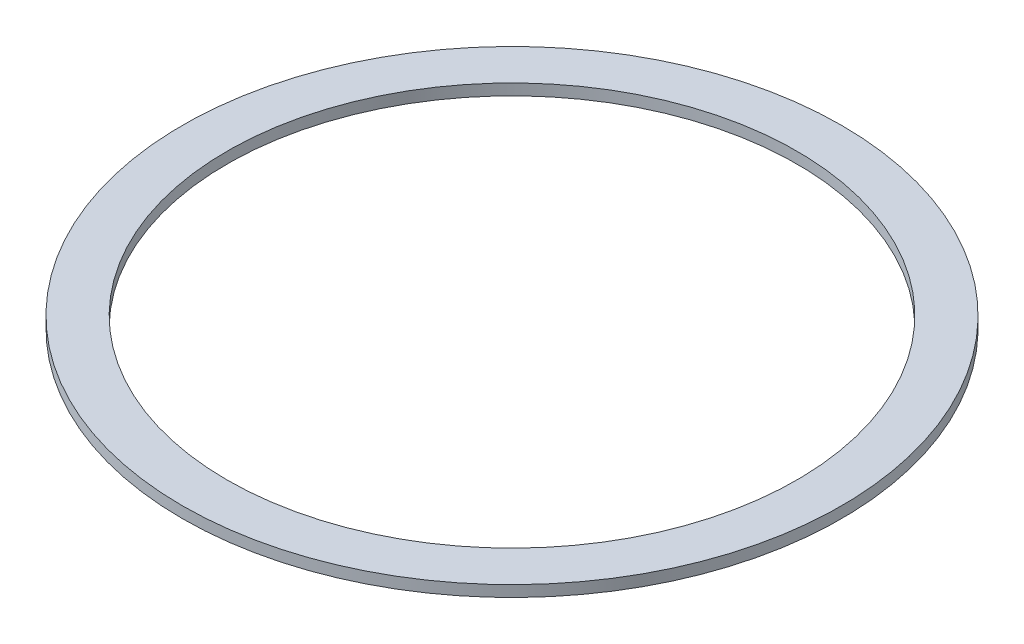
ISO-10303-21;
HEADER;
FILE_DESCRIPTION(('STEP AP214'),'2;1');
FILE_NAME('part.step','',(''),(''),'','','');
FILE_SCHEMA(('AUTOMOTIVE_DESIGN { 1 0 10303 214 1 1 1 1 }'));
ENDSEC;
DATA;
#1=APPLICATION_CONTEXT('core data for automotive mechanical design processes');
#2=APPLICATION_PROTOCOL_DEFINITION('international standard','automotive_design',2000,#1);
#3=PRODUCT_CONTEXT('',#1,'mechanical');
#4=PRODUCT('Part','Part','',(#3));
#5=PRODUCT_RELATED_PRODUCT_CATEGORY('part','',(#4));
#6=PRODUCT_DEFINITION_FORMATION('','',#4);
#7=PRODUCT_DEFINITION_CONTEXT('part definition',#1,'design');
#8=PRODUCT_DEFINITION('design','',#6,#7);
#9=PRODUCT_DEFINITION_SHAPE('','',#8);
#10=(LENGTH_UNIT() NAMED_UNIT(*) SI_UNIT(.MILLI.,.METRE.));
#11=(NAMED_UNIT(*) PLANE_ANGLE_UNIT() SI_UNIT($,.RADIAN.));
#12=(NAMED_UNIT(*) SI_UNIT($,.STERADIAN.) SOLID_ANGLE_UNIT());
#13=UNCERTAINTY_MEASURE_WITH_UNIT(LENGTH_MEASURE(1.E-05),#10,'distance_accuracy_value','');
#14=(GEOMETRIC_REPRESENTATION_CONTEXT(3) GLOBAL_UNCERTAINTY_ASSIGNED_CONTEXT((#13)) GLOBAL_UNIT_ASSIGNED_CONTEXT((#10,
#11,#12)) REPRESENTATION_CONTEXT('',''));
#15=CARTESIAN_POINT('',(0.,0.,0.));
#16=DIRECTION('',(0.,0.,1.));
#17=DIRECTION('',(1.,0.,0.));
#18=AXIS2_PLACEMENT_3D('',#15,#16,#17);
#19=CARTESIAN_POINT('',(0.,5.,0.));
#20=DIRECTION('',(0.,1.,0.));
#21=DIRECTION('',(0.,0.,1.));
#22=AXIS2_PLACEMENT_3D('',#19,#20,#21);
#23=PLANE('',#22);
#24=CARTESIAN_POINT('',(0.,5.,0.));
#25=DIRECTION('',(0.,1.,0.));
#26=DIRECTION('',(0.,0.,1.));
#27=AXIS2_PLACEMENT_3D('',#24,#25,#26);
#28=CIRCLE('',#27,295.);
#29=CARTESIAN_POINT('',(0.,5.,295.));
#30=VERTEX_POINT('',#29);
#31=EDGE_CURVE('E10',#30,#30,#28,.T.);
#32=ORIENTED_EDGE('',*,*,#31,.T.);
#33=EDGE_LOOP('',(#32));
#34=FACE_BOUND('',#33,.T.);
#35=CARTESIAN_POINT('',(0.,5.,0.));
#36=DIRECTION('',(0.,1.,0.));
#37=DIRECTION('',(0.,0.,1.));
#38=AXIS2_PLACEMENT_3D('',#35,#36,#37);
#39=CIRCLE('',#38,255.);
#40=CARTESIAN_POINT('',(0.,5.,255.));
#41=VERTEX_POINT('',#40);
#42=EDGE_CURVE('E50',#41,#41,#39,.T.);
#43=ORIENTED_EDGE('',*,*,#42,.F.);
#44=EDGE_LOOP('',(#43));
#45=FACE_BOUND('',#44,.T.);
#46=ADVANCED_FACE('F37',(#34,#45),#23,.T.);
#47=CARTESIAN_POINT('',(0.,-5.,0.));
#48=DIRECTION('',(0.,1.,0.));
#49=DIRECTION('',(0.,0.,1.));
#50=AXIS2_PLACEMENT_3D('',#47,#48,#49);
#51=PLANE('',#50);
#52=CARTESIAN_POINT('',(0.,-5.,0.));
#53=DIRECTION('',(0.,1.,0.));
#54=DIRECTION('',(0.,0.,1.));
#55=AXIS2_PLACEMENT_3D('',#52,#53,#54);
#56=CIRCLE('',#55,295.);
#57=CARTESIAN_POINT('',(0.,-5.,295.));
#58=VERTEX_POINT('',#57);
#59=EDGE_CURVE('E41',#58,#58,#56,.T.);
#60=ORIENTED_EDGE('',*,*,#59,.F.);
#61=EDGE_LOOP('',(#60));
#62=FACE_BOUND('',#61,.T.);
#63=CARTESIAN_POINT('',(0.,-5.,0.));
#64=DIRECTION('',(0.,1.,0.));
#65=DIRECTION('',(0.,0.,1.));
#66=AXIS2_PLACEMENT_3D('',#63,#64,#65);
#67=CIRCLE('',#66,255.);
#68=CARTESIAN_POINT('',(0.,-5.,255.));
#69=VERTEX_POINT('',#68);
#70=EDGE_CURVE('E52',#69,#69,#67,.T.);
#71=ORIENTED_EDGE('',*,*,#70,.T.);
#72=EDGE_LOOP('',(#71));
#73=FACE_BOUND('',#72,.T.);
#74=ADVANCED_FACE('F64',(#62,#73),#51,.F.);
#75=CARTESIAN_POINT('',(0.,5.,0.));
#76=DIRECTION('',(0.,-1.,0.));
#77=DIRECTION('',(0.,0.,-1.));
#78=AXIS2_PLACEMENT_3D('',#75,#76,#77);
#79=CYLINDRICAL_SURFACE('',#78,295.);
#80=ORIENTED_EDGE('',*,*,#31,.F.);
#81=EDGE_LOOP('',(#80));
#82=FACE_BOUND('',#81,.T.);
#83=ORIENTED_EDGE('',*,*,#59,.T.);
#84=EDGE_LOOP('',(#83));
#85=FACE_BOUND('',#84,.T.);
#86=ADVANCED_FACE('F39',(#82,#85),#79,.T.);
#87=CARTESIAN_POINT('',(0.,5.,0.));
#88=DIRECTION('',(0.,-1.,0.));
#89=DIRECTION('',(0.,0.,-1.));
#90=AXIS2_PLACEMENT_3D('',#87,#88,#89);
#91=CYLINDRICAL_SURFACE('',#90,255.);
#92=ORIENTED_EDGE('',*,*,#42,.T.);
#93=EDGE_LOOP('',(#92));
#94=FACE_BOUND('',#93,.T.);
#95=ORIENTED_EDGE('',*,*,#70,.F.);
#96=EDGE_LOOP('',(#95));
#97=FACE_BOUND('',#96,.T.);
#98=ADVANCED_FACE('F60',(#94,#97),#91,.F.);
#99=CLOSED_SHELL('',(#46,#74,#86,#98));
#100=MANIFOLD_SOLID_BREP('B2',#99);
#101=ADVANCED_BREP_SHAPE_REPRESENTATION('',(#18,#100),#14);
#102=SHAPE_DEFINITION_REPRESENTATION(#9,#101);
ENDSEC;
END-ISO-10303-21;
